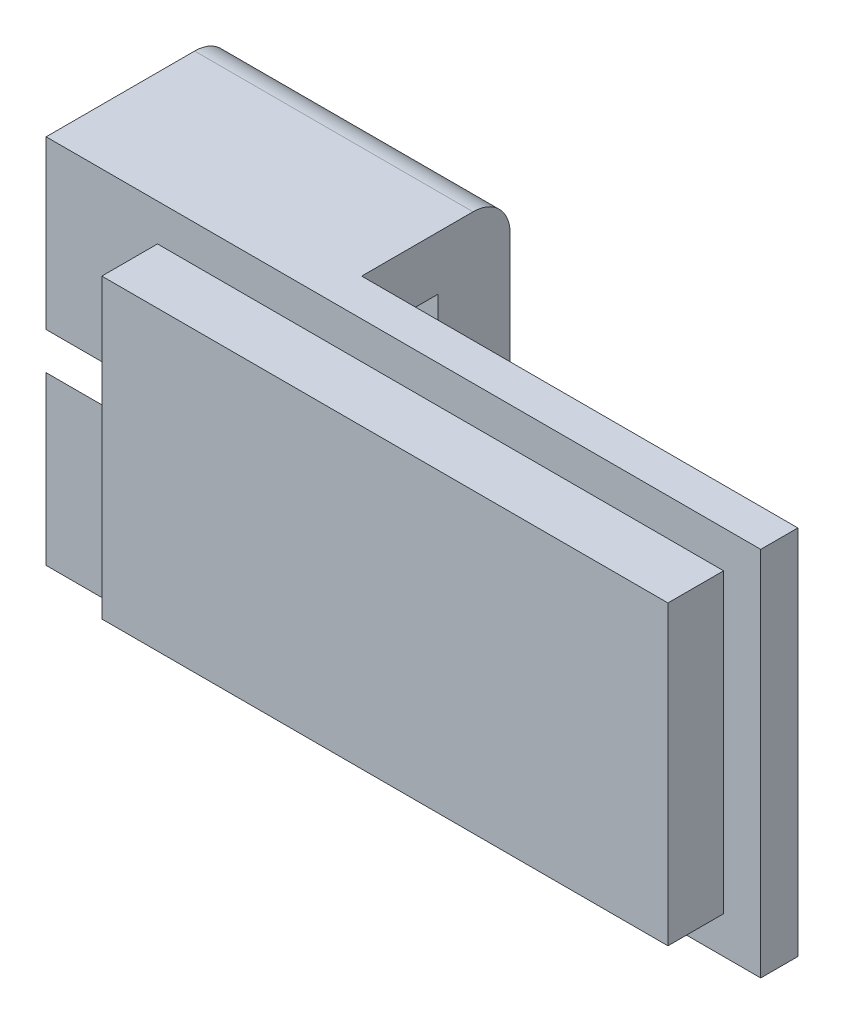
ISO-10303-21;
HEADER;
FILE_DESCRIPTION(('STEP AP214'),'2;1');
FILE_NAME('part.step','',(''),(''),'','','');
FILE_SCHEMA(('AUTOMOTIVE_DESIGN { 1 0 10303 214 1 1 1 1 }'));
ENDSEC;
DATA;
#1=APPLICATION_CONTEXT('core data for automotive mechanical design processes');
#2=APPLICATION_PROTOCOL_DEFINITION('international standard','automotive_design',2000,#1);
#3=PRODUCT_CONTEXT('',#1,'mechanical');
#4=PRODUCT('Part','Part','',(#3));
#5=PRODUCT_RELATED_PRODUCT_CATEGORY('part','',(#4));
#6=PRODUCT_DEFINITION_FORMATION('','',#4);
#7=PRODUCT_DEFINITION_CONTEXT('part definition',#1,'design');
#8=PRODUCT_DEFINITION('design','',#6,#7);
#9=PRODUCT_DEFINITION_SHAPE('','',#8);
#10=(LENGTH_UNIT() NAMED_UNIT(*) SI_UNIT(.MILLI.,.METRE.));
#11=(NAMED_UNIT(*) PLANE_ANGLE_UNIT() SI_UNIT($,.RADIAN.));
#12=(NAMED_UNIT(*) SI_UNIT($,.STERADIAN.) SOLID_ANGLE_UNIT());
#13=UNCERTAINTY_MEASURE_WITH_UNIT(LENGTH_MEASURE(1.E-05),#10,'distance_accuracy_value','');
#14=(GEOMETRIC_REPRESENTATION_CONTEXT(3) GLOBAL_UNCERTAINTY_ASSIGNED_CONTEXT((#13)) GLOBAL_UNIT_ASSIGNED_CONTEXT((#10,
#11,#12)) REPRESENTATION_CONTEXT('',''));
#15=CARTESIAN_POINT('',(0.,0.,0.));
#16=DIRECTION('',(0.,0.,1.));
#17=DIRECTION('',(1.,0.,0.));
#18=AXIS2_PLACEMENT_3D('',#15,#16,#17);
#19=CARTESIAN_POINT('',(38.5,0.,0.));
#20=DIRECTION('',(1.,0.,0.));
#21=DIRECTION('',(0.,0.,-1.));
#22=AXIS2_PLACEMENT_3D('',#19,#20,#21);
#23=PLANE('',#22);
#24=DIRECTION('',(0.,0.,-1.));
#25=VECTOR('',#24,1.);
#26=CARTESIAN_POINT('',(38.5,-10.,5.));
#27=LINE('',#26,#25);
#28=CARTESIAN_POINT('',(38.5,-10.,5.));
#29=VERTEX_POINT('',#28);
#30=CARTESIAN_POINT('',(38.5,-9.99999999999999,3.));
#31=VERTEX_POINT('',#30);
#32=EDGE_CURVE('E384',#29,#31,#27,.T.);
#33=ORIENTED_EDGE('',*,*,#32,.T.);
#34=DIRECTION('',(0.,-1.,0.));
#35=VECTOR('',#34,1.);
#36=CARTESIAN_POINT('',(38.5,-9.99999999999999,3.));
#37=LINE('',#36,#35);
#38=CARTESIAN_POINT('',(38.5,10.,3.));
#39=VERTEX_POINT('',#38);
#40=EDGE_CURVE('E306',#39,#31,#37,.T.);
#41=ORIENTED_EDGE('',*,*,#40,.F.);
#42=DIRECTION('',(0.,0.,1.));
#43=VECTOR('',#42,1.);
#44=CARTESIAN_POINT('',(38.5,10.,5.));
#45=LINE('',#44,#43);
#46=CARTESIAN_POINT('',(38.5,10.,5.));
#47=VERTEX_POINT('',#46);
#48=EDGE_CURVE('E377',#39,#47,#45,.T.);
#49=ORIENTED_EDGE('',*,*,#48,.T.);
#50=DIRECTION('',(0.,-1.,0.));
#51=VECTOR('',#50,1.);
#52=CARTESIAN_POINT('',(38.5,-10.,5.));
#53=LINE('',#52,#51);
#54=EDGE_CURVE('E380',#47,#29,#53,.T.);
#55=ORIENTED_EDGE('',*,*,#54,.T.);
#56=EDGE_LOOP('',(#33,#41,#49,#55));
#57=FACE_BOUND('',#56,.T.);
#58=ADVANCED_FACE('F45',(#57),#23,.T.);
#59=CARTESIAN_POINT('',(38.5,-10.,5.));
#60=DIRECTION('',(0.,0.,-1.));
#61=DIRECTION('',(-1.,0.,0.));
#62=AXIS2_PLACEMENT_3D('',#59,#60,#61);
#63=PLANE('',#62);
#64=DIRECTION('',(-1.,0.,0.));
#65=VECTOR('',#64,1.);
#66=CARTESIAN_POINT('',(9.99999999999998,-1.00498756211208,5.));
#67=LINE('',#66,#65);
#68=CARTESIAN_POINT('',(0.,-1.00498756211208,5.));
#69=VERTEX_POINT('',#68);
#70=CARTESIAN_POINT('',(6.,-1.00498756211208,5.));
#71=VERTEX_POINT('',#70);
#72=EDGE_CURVE('E337',#69,#71,#67,.F.);
#73=ORIENTED_EDGE('',*,*,#72,.F.);
#74=DIRECTION('',(0.,-1.,0.));
#75=VECTOR('',#74,1.);
#76=CARTESIAN_POINT('',(0.,-10.,5.));
#77=LINE('',#76,#75);
#78=CARTESIAN_POINT('',(0.,-10.,5.));
#79=VERTEX_POINT('',#78);
#80=EDGE_CURVE('E391',#69,#79,#77,.T.);
#81=ORIENTED_EDGE('',*,*,#80,.T.);
#82=DIRECTION('',(-1.,0.,0.));
#83=VECTOR('',#82,1.);
#84=CARTESIAN_POINT('',(38.5,-10.,5.));
#85=LINE('',#84,#83);
#86=EDGE_CURVE('E388',#29,#79,#85,.T.);
#87=ORIENTED_EDGE('',*,*,#86,.F.);
#88=ORIENTED_EDGE('',*,*,#54,.F.);
#89=DIRECTION('',(-1.,0.,0.));
#90=VECTOR('',#89,1.);
#91=CARTESIAN_POINT('',(38.5,10.,5.));
#92=LINE('',#91,#90);
#93=CARTESIAN_POINT('',(0.,10.,5.));
#94=VERTEX_POINT('',#93);
#95=EDGE_CURVE('E406',#47,#94,#92,.T.);
#96=ORIENTED_EDGE('',*,*,#95,.T.);
#97=CARTESIAN_POINT('',(0.,1.00498756211208,5.));
#98=VERTEX_POINT('',#97);
#99=EDGE_CURVE('E392',#94,#98,#77,.T.);
#100=ORIENTED_EDGE('',*,*,#99,.T.);
#101=DIRECTION('',(-1.,0.,0.));
#102=VECTOR('',#101,1.);
#103=CARTESIAN_POINT('',(9.99999999999998,1.00498756211208,5.));
#104=LINE('',#103,#102);
#105=CARTESIAN_POINT('',(6.,1.00498756211208,5.));
#106=VERTEX_POINT('',#105);
#107=EDGE_CURVE('E330',#106,#98,#104,.T.);
#108=ORIENTED_EDGE('',*,*,#107,.F.);
#109=DIRECTION('',(0.,-1.,0.));
#110=VECTOR('',#109,1.);
#111=CARTESIAN_POINT('',(6.,-10.,5.));
#112=LINE('',#111,#110);
#113=CARTESIAN_POINT('',(6.,8.,5.));
#114=VERTEX_POINT('',#113);
#115=EDGE_CURVE('E411',#114,#106,#112,.T.);
#116=ORIENTED_EDGE('',*,*,#115,.F.);
#117=DIRECTION('',(-1.,0.,0.));
#118=VECTOR('',#117,1.);
#119=CARTESIAN_POINT('',(38.5,8.00000000000001,5.));
#120=LINE('',#119,#118);
#121=CARTESIAN_POINT('',(36.5,8.00000000000001,5.));
#122=VERTEX_POINT('',#121);
#123=EDGE_CURVE('E415',#122,#114,#120,.T.);
#124=ORIENTED_EDGE('',*,*,#123,.F.);
#125=DIRECTION('',(0.,1.,0.));
#126=VECTOR('',#125,1.);
#127=CARTESIAN_POINT('',(36.5,-10.,5.));
#128=LINE('',#127,#126);
#129=CARTESIAN_POINT('',(36.5,-7.99999999999999,5.));
#130=VERTEX_POINT('',#129);
#131=EDGE_CURVE('E419',#130,#122,#128,.T.);
#132=ORIENTED_EDGE('',*,*,#131,.F.);
#133=DIRECTION('',(1.,0.,0.));
#134=VECTOR('',#133,1.);
#135=CARTESIAN_POINT('',(38.5,-7.99999999999999,5.));
#136=LINE('',#135,#134);
#137=CARTESIAN_POINT('',(6.,-8.,5.));
#138=VERTEX_POINT('',#137);
#139=EDGE_CURVE('E423',#138,#130,#136,.T.);
#140=ORIENTED_EDGE('',*,*,#139,.F.);
#141=EDGE_CURVE('E410',#71,#138,#112,.T.);
#142=ORIENTED_EDGE('',*,*,#141,.F.);
#143=EDGE_LOOP('',(#73,#81,#87,#88,#96,#100,#108,#116,#124,#132,#140,#142));
#144=FACE_BOUND('',#143,.T.);
#145=ADVANCED_FACE('F514',(#144),#63,.F.);
#146=CARTESIAN_POINT('',(38.5,-9.99999999999999,-5.));
#147=DIRECTION('',(0.,0.,1.));
#148=DIRECTION('',(1.,0.,0.));
#149=AXIS2_PLACEMENT_3D('',#146,#147,#148);
#150=PLANE('',#149);
#151=DIRECTION('',(-1.,0.,0.));
#152=VECTOR('',#151,1.);
#153=CARTESIAN_POINT('',(38.5,8.,-5.));
#154=LINE('',#153,#152);
#155=CARTESIAN_POINT('',(0.,8.,-5.));
#156=VERTEX_POINT('',#155);
#157=CARTESIAN_POINT('',(15.,8.,-5.));
#158=VERTEX_POINT('',#157);
#159=EDGE_CURVE('E434',#156,#158,#154,.F.);
#160=ORIENTED_EDGE('',*,*,#159,.T.);
#161=DIRECTION('',(0.,1.,0.));
#162=VECTOR('',#161,1.);
#163=CARTESIAN_POINT('',(15.,-9.99999999999999,-5.));
#164=LINE('',#163,#162);
#165=CARTESIAN_POINT('',(15.,-7.99999999999999,-5.));
#166=VERTEX_POINT('',#165);
#167=EDGE_CURVE('E251',#166,#158,#164,.T.);
#168=ORIENTED_EDGE('',*,*,#167,.F.);
#169=DIRECTION('',(-1.,0.,0.));
#170=VECTOR('',#169,1.);
#171=CARTESIAN_POINT('',(38.5,-7.99999999999999,-5.));
#172=LINE('',#171,#170);
#173=CARTESIAN_POINT('',(0.,-7.99999999999999,-5.));
#174=VERTEX_POINT('',#173);
#175=EDGE_CURVE('E438',#166,#174,#172,.T.);
#176=ORIENTED_EDGE('',*,*,#175,.T.);
#177=DIRECTION('',(0.,1.,0.));
#178=VECTOR('',#177,1.);
#179=CARTESIAN_POINT('',(0.,-9.99999999999999,-5.));
#180=LINE('',#179,#178);
#181=CARTESIAN_POINT('',(0.,-1.00498756211209,-5.));
#182=VERTEX_POINT('',#181);
#183=EDGE_CURVE('E381',#174,#182,#180,.T.);
#184=ORIENTED_EDGE('',*,*,#183,.T.);
#185=DIRECTION('',(-1.,0.,0.));
#186=VECTOR('',#185,1.);
#187=CARTESIAN_POINT('',(9.99999999999998,-1.00498756211209,-5.));
#188=LINE('',#187,#186);
#189=CARTESIAN_POINT('',(9.99999999999998,-1.00498756211209,-5.));
#190=VERTEX_POINT('',#189);
#191=EDGE_CURVE('E340',#190,#182,#188,.T.);
#192=ORIENTED_EDGE('',*,*,#191,.F.);
#193=DIRECTION('',(0.,1.,0.));
#194=VECTOR('',#193,1.);
#195=CARTESIAN_POINT('',(9.99999999999998,-9.99999999999999,-5.));
#196=LINE('',#195,#194);
#197=CARTESIAN_POINT('',(9.99999999999998,1.00498756211209,-5.));
#198=VERTEX_POINT('',#197);
#199=EDGE_CURVE('E430',#190,#198,#196,.T.);
#200=ORIENTED_EDGE('',*,*,#199,.T.);
#201=DIRECTION('',(-1.,0.,0.));
#202=VECTOR('',#201,1.);
#203=CARTESIAN_POINT('',(9.99999999999998,1.00498756211209,-5.));
#204=LINE('',#203,#202);
#205=CARTESIAN_POINT('',(0.,1.00498756211209,-5.));
#206=VERTEX_POINT('',#205);
#207=EDGE_CURVE('E344',#206,#198,#204,.F.);
#208=ORIENTED_EDGE('',*,*,#207,.F.);
#209=EDGE_CURVE('E400',#206,#156,#180,.T.);
#210=ORIENTED_EDGE('',*,*,#209,.T.);
#211=EDGE_LOOP('',(#160,#168,#176,#184,#192,#200,#208,#210));
#212=FACE_BOUND('',#211,.T.);
#213=ADVANCED_FACE('F463',(#212),#150,.F.);
#214=CARTESIAN_POINT('',(0.,0.,0.));
#215=DIRECTION('',(1.,0.,0.));
#216=DIRECTION('',(0.,0.,-1.));
#217=AXIS2_PLACEMENT_3D('',#214,#215,#216);
#218=PLANE('',#217);
#219=ORIENTED_EDGE('',*,*,#183,.F.);
#220=CARTESIAN_POINT('',(0.,-7.99999999999999,-3.));
#221=DIRECTION('',(1.,0.,0.));
#222=DIRECTION('',(0.,0.,-1.));
#223=AXIS2_PLACEMENT_3D('',#220,#221,#222);
#224=CIRCLE('',#223,2.);
#225=CARTESIAN_POINT('',(0.,-9.99999999999999,-3.));
#226=VERTEX_POINT('',#225);
#227=EDGE_CURVE('E441',#174,#226,#224,.F.);
#228=ORIENTED_EDGE('',*,*,#227,.T.);
#229=DIRECTION('',(0.,0.,-1.));
#230=VECTOR('',#229,1.);
#231=CARTESIAN_POINT('',(0.,-10.,5.));
#232=LINE('',#231,#230);
#233=EDGE_CURVE('E396',#79,#226,#232,.T.);
#234=ORIENTED_EDGE('',*,*,#233,.F.);
#235=ORIENTED_EDGE('',*,*,#80,.F.);
#236=CARTESIAN_POINT('',(0.,0.,0.));
#237=DIRECTION('',(1.,0.,0.));
#238=DIRECTION('',(0.,0.,-1.));
#239=AXIS2_PLACEMENT_3D('',#236,#237,#238);
#240=CIRCLE('',#239,5.1);
#241=EDGE_CURVE('E325',#69,#182,#240,.T.);
#242=ORIENTED_EDGE('',*,*,#241,.T.);
#243=EDGE_LOOP('',(#219,#228,#234,#235,#242));
#244=FACE_BOUND('',#243,.T.);
#245=ADVANCED_FACE('F501',(#244),#218,.F.);
#246=CARTESIAN_POINT('',(38.5,10.,5.));
#247=DIRECTION('',(0.,-1.,0.));
#248=DIRECTION('',(0.,0.,-1.));
#249=AXIS2_PLACEMENT_3D('',#246,#247,#248);
#250=PLANE('',#249);
#251=DIRECTION('',(1.,0.,0.));
#252=VECTOR('',#251,1.);
#253=CARTESIAN_POINT('',(15.,10.,3.));
#254=LINE('',#253,#252);
#255=CARTESIAN_POINT('',(15.,10.,3.));
#256=VERTEX_POINT('',#255);
#257=EDGE_CURVE('E303',#256,#39,#254,.T.);
#258=ORIENTED_EDGE('',*,*,#257,.F.);
#259=DIRECTION('',(0.,0.,-1.));
#260=VECTOR('',#259,1.);
#261=CARTESIAN_POINT('',(15.,10.,3.));
#262=LINE('',#261,#260);
#263=CARTESIAN_POINT('',(15.,10.,-3.));
#264=VERTEX_POINT('',#263);
#265=EDGE_CURVE('E313',#256,#264,#262,.T.);
#266=ORIENTED_EDGE('',*,*,#265,.T.);
#267=DIRECTION('',(-1.,0.,0.));
#268=VECTOR('',#267,1.);
#269=CARTESIAN_POINT('',(38.5,10.,-3.));
#270=LINE('',#269,#268);
#271=CARTESIAN_POINT('',(0.,10.,-3.));
#272=VERTEX_POINT('',#271);
#273=EDGE_CURVE('E448',#264,#272,#270,.T.);
#274=ORIENTED_EDGE('',*,*,#273,.T.);
#275=DIRECTION('',(0.,0.,1.));
#276=VECTOR('',#275,1.);
#277=CARTESIAN_POINT('',(0.,10.,5.));
#278=LINE('',#277,#276);
#279=EDGE_CURVE('E376',#272,#94,#278,.T.);
#280=ORIENTED_EDGE('',*,*,#279,.T.);
#281=ORIENTED_EDGE('',*,*,#95,.F.);
#282=ORIENTED_EDGE('',*,*,#48,.F.);
#283=EDGE_LOOP('',(#258,#266,#274,#280,#281,#282));
#284=FACE_BOUND('',#283,.T.);
#285=ADVANCED_FACE('F471',(#284),#250,.F.);
#286=CARTESIAN_POINT('',(38.5,-10.,5.));
#287=DIRECTION('',(0.,1.,0.));
#288=DIRECTION('',(0.,0.,1.));
#289=AXIS2_PLACEMENT_3D('',#286,#287,#288);
#290=PLANE('',#289);
#291=DIRECTION('',(-1.,0.,0.));
#292=VECTOR('',#291,1.);
#293=CARTESIAN_POINT('',(38.5,-9.99999999999999,-3.));
#294=LINE('',#293,#292);
#295=CARTESIAN_POINT('',(15.,-9.99999999999999,-3.));
#296=VERTEX_POINT('',#295);
#297=EDGE_CURVE('E444',#226,#296,#294,.F.);
#298=ORIENTED_EDGE('',*,*,#297,.T.);
#299=DIRECTION('',(0.,0.,-1.));
#300=VECTOR('',#299,1.);
#301=CARTESIAN_POINT('',(15.,-9.99999999999999,3.));
#302=LINE('',#301,#300);
#303=CARTESIAN_POINT('',(15.,-9.99999999999999,3.));
#304=VERTEX_POINT('',#303);
#305=EDGE_CURVE('E316',#304,#296,#302,.T.);
#306=ORIENTED_EDGE('',*,*,#305,.F.);
#307=DIRECTION('',(-1.,0.,0.));
#308=VECTOR('',#307,1.);
#309=CARTESIAN_POINT('',(15.,-9.99999999999999,3.));
#310=LINE('',#309,#308);
#311=EDGE_CURVE('E309',#31,#304,#310,.T.);
#312=ORIENTED_EDGE('',*,*,#311,.F.);
#313=ORIENTED_EDGE('',*,*,#32,.F.);
#314=ORIENTED_EDGE('',*,*,#86,.T.);
#315=ORIENTED_EDGE('',*,*,#233,.T.);
#316=EDGE_LOOP('',(#298,#306,#312,#313,#314,#315));
#317=FACE_BOUND('',#316,.T.);
#318=ADVANCED_FACE('F483',(#317),#290,.F.);
#319=ORIENTED_EDGE('',*,*,#279,.F.);
#320=CARTESIAN_POINT('',(0.,8.,-3.));
#321=DIRECTION('',(1.,0.,0.));
#322=DIRECTION('',(0.,0.,-1.));
#323=AXIS2_PLACEMENT_3D('',#320,#321,#322);
#324=CIRCLE('',#323,2.);
#325=EDGE_CURVE('E54',#272,#156,#324,.F.);
#326=ORIENTED_EDGE('',*,*,#325,.T.);
#327=ORIENTED_EDGE('',*,*,#209,.F.);
#328=EDGE_CURVE('E331',#206,#98,#240,.T.);
#329=ORIENTED_EDGE('',*,*,#328,.T.);
#330=ORIENTED_EDGE('',*,*,#99,.F.);
#331=EDGE_LOOP('',(#319,#326,#327,#329,#330));
#332=FACE_BOUND('',#331,.T.);
#333=ADVANCED_FACE('F456',(#332),#218,.F.);
#334=CARTESIAN_POINT('',(6.,-8.,7.99999999999998));
#335=DIRECTION('',(0.,1.,0.));
#336=DIRECTION('',(-1.,0.,0.));
#337=AXIS2_PLACEMENT_3D('',#334,#335,#336);
#338=PLANE('',#337);
#339=DIRECTION('',(0.,0.,-1.));
#340=VECTOR('',#339,1.);
#341=CARTESIAN_POINT('',(6.,-8.,7.99999999999998));
#342=LINE('',#341,#340);
#343=CARTESIAN_POINT('',(6.,-8.,7.99999999999998));
#344=VERTEX_POINT('',#343);
#345=EDGE_CURVE('E360',#344,#138,#342,.T.);
#346=ORIENTED_EDGE('',*,*,#345,.T.);
#347=ORIENTED_EDGE('',*,*,#139,.T.);
#348=DIRECTION('',(0.,0.,-1.));
#349=VECTOR('',#348,1.);
#350=CARTESIAN_POINT('',(36.5,-7.99999999999999,7.99999999999998));
#351=LINE('',#350,#349);
#352=CARTESIAN_POINT('',(36.5,-7.99999999999999,7.99999999999998));
#353=VERTEX_POINT('',#352);
#354=EDGE_CURVE('E372',#353,#130,#351,.T.);
#355=ORIENTED_EDGE('',*,*,#354,.F.);
#356=DIRECTION('',(1.,0.,0.));
#357=VECTOR('',#356,1.);
#358=CARTESIAN_POINT('',(6.,-8.,7.99999999999998));
#359=LINE('',#358,#357);
#360=EDGE_CURVE('E347',#344,#353,#359,.T.);
#361=ORIENTED_EDGE('',*,*,#360,.F.);
#362=EDGE_LOOP('',(#346,#347,#355,#361));
#363=FACE_BOUND('',#362,.T.);
#364=ADVANCED_FACE('F517',(#363),#338,.F.);
#365=CARTESIAN_POINT('',(36.5,-7.99999999999999,7.99999999999998));
#366=DIRECTION('',(-1.,0.,0.));
#367=DIRECTION('',(0.,0.,1.));
#368=AXIS2_PLACEMENT_3D('',#365,#366,#367);
#369=PLANE('',#368);
#370=ORIENTED_EDGE('',*,*,#354,.T.);
#371=ORIENTED_EDGE('',*,*,#131,.T.);
#372=DIRECTION('',(0.,0.,-1.));
#373=VECTOR('',#372,1.);
#374=CARTESIAN_POINT('',(36.5,8.00000000000001,7.99999999999998));
#375=LINE('',#374,#373);
#376=CARTESIAN_POINT('',(36.5,8.00000000000001,7.99999999999998));
#377=VERTEX_POINT('',#376);
#378=EDGE_CURVE('E368',#377,#122,#375,.T.);
#379=ORIENTED_EDGE('',*,*,#378,.F.);
#380=DIRECTION('',(0.,1.,0.));
#381=VECTOR('',#380,1.);
#382=CARTESIAN_POINT('',(36.5,-7.99999999999999,7.99999999999998));
#383=LINE('',#382,#381);
#384=EDGE_CURVE('E351',#353,#377,#383,.T.);
#385=ORIENTED_EDGE('',*,*,#384,.F.);
#386=EDGE_LOOP('',(#370,#371,#379,#385));
#387=FACE_BOUND('',#386,.T.);
#388=ADVANCED_FACE('F527',(#387),#369,.F.);
#389=CARTESIAN_POINT('',(6.,8.,7.99999999999998));
#390=DIRECTION('',(0.,-1.,0.));
#391=DIRECTION('',(1.,0.,0.));
#392=AXIS2_PLACEMENT_3D('',#389,#390,#391);
#393=PLANE('',#392);
#394=ORIENTED_EDGE('',*,*,#378,.T.);
#395=ORIENTED_EDGE('',*,*,#123,.T.);
#396=DIRECTION('',(0.,0.,-1.));
#397=VECTOR('',#396,1.);
#398=CARTESIAN_POINT('',(6.,8.,7.99999999999998));
#399=LINE('',#398,#397);
#400=CARTESIAN_POINT('',(6.,8.,7.99999999999998));
#401=VERTEX_POINT('',#400);
#402=EDGE_CURVE('E364',#401,#114,#399,.T.);
#403=ORIENTED_EDGE('',*,*,#402,.F.);
#404=DIRECTION('',(-1.,0.,0.));
#405=VECTOR('',#404,1.);
#406=CARTESIAN_POINT('',(6.,8.,7.99999999999998));
#407=LINE('',#406,#405);
#408=EDGE_CURVE('E354',#377,#401,#407,.T.);
#409=ORIENTED_EDGE('',*,*,#408,.F.);
#410=EDGE_LOOP('',(#394,#395,#403,#409));
#411=FACE_BOUND('',#410,.T.);
#412=ADVANCED_FACE('F524',(#411),#393,.F.);
#413=CARTESIAN_POINT('',(6.,-8.,7.99999999999998));
#414=DIRECTION('',(1.,0.,0.));
#415=DIRECTION('',(0.,0.,-1.));
#416=AXIS2_PLACEMENT_3D('',#413,#414,#415);
#417=PLANE('',#416);
#418=CARTESIAN_POINT('',(6.,0.,0.));
#419=DIRECTION('',(1.,0.,0.));
#420=DIRECTION('',(0.,0.,-1.));
#421=AXIS2_PLACEMENT_3D('',#418,#419,#420);
#422=CIRCLE('',#421,5.1);
#423=EDGE_CURVE('E427',#71,#106,#422,.F.);
#424=ORIENTED_EDGE('',*,*,#423,.F.);
#425=ORIENTED_EDGE('',*,*,#141,.T.);
#426=ORIENTED_EDGE('',*,*,#345,.F.);
#427=DIRECTION('',(0.,-1.,0.));
#428=VECTOR('',#427,1.);
#429=CARTESIAN_POINT('',(6.,-8.,7.99999999999998));
#430=LINE('',#429,#428);
#431=EDGE_CURVE('E357',#401,#344,#430,.T.);
#432=ORIENTED_EDGE('',*,*,#431,.F.);
#433=ORIENTED_EDGE('',*,*,#402,.T.);
#434=ORIENTED_EDGE('',*,*,#115,.T.);
#435=EDGE_LOOP('',(#424,#425,#426,#432,#433,#434));
#436=FACE_BOUND('',#435,.T.);
#437=ADVANCED_FACE('F510',(#436),#417,.F.);
#438=CARTESIAN_POINT('',(0.,0.,7.99999999999998));
#439=DIRECTION('',(0.,0.,1.));
#440=DIRECTION('',(1.,0.,0.));
#441=AXIS2_PLACEMENT_3D('',#438,#439,#440);
#442=PLANE('',#441);
#443=ORIENTED_EDGE('',*,*,#360,.T.);
#444=ORIENTED_EDGE('',*,*,#384,.T.);
#445=ORIENTED_EDGE('',*,*,#408,.T.);
#446=ORIENTED_EDGE('',*,*,#431,.T.);
#447=EDGE_LOOP('',(#443,#444,#445,#446));
#448=FACE_BOUND('',#447,.T.);
#449=ADVANCED_FACE('F519',(#448),#442,.T.);
#450=CARTESIAN_POINT('',(9.99999999999998,0.,0.));
#451=DIRECTION('',(1.,0.,0.));
#452=DIRECTION('',(0.,0.,-1.));
#453=AXIS2_PLACEMENT_3D('',#450,#451,#452);
#454=PLANE('',#453);
#455=CARTESIAN_POINT('',(9.99999999999998,0.,0.));
#456=DIRECTION('',(1.,0.,0.));
#457=DIRECTION('',(0.,0.,-1.));
#458=AXIS2_PLACEMENT_3D('',#455,#456,#457);
#459=CIRCLE('',#458,5.1);
#460=EDGE_CURVE('E326',#198,#190,#459,.T.);
#461=ORIENTED_EDGE('',*,*,#460,.F.);
#462=ORIENTED_EDGE('',*,*,#199,.F.);
#463=EDGE_LOOP('',(#461,#462));
#464=FACE_BOUND('',#463,.T.);
#465=ADVANCED_FACE('F555',(#464),#454,.F.);
#466=CARTESIAN_POINT('',(9.99999999999998,0.,0.));
#467=DIRECTION('',(-1.,0.,0.));
#468=DIRECTION('',(0.,0.,1.));
#469=AXIS2_PLACEMENT_3D('',#466,#467,#468);
#470=CYLINDRICAL_SURFACE('',#469,5.1);
#471=ORIENTED_EDGE('',*,*,#207,.T.);
#472=ORIENTED_EDGE('',*,*,#460,.T.);
#473=ORIENTED_EDGE('',*,*,#191,.T.);
#474=ORIENTED_EDGE('',*,*,#241,.F.);
#475=ORIENTED_EDGE('',*,*,#72,.T.);
#476=ORIENTED_EDGE('',*,*,#423,.T.);
#477=ORIENTED_EDGE('',*,*,#107,.T.);
#478=ORIENTED_EDGE('',*,*,#328,.F.);
#479=EDGE_LOOP('',(#471,#472,#473,#474,#475,#476,#477,#478));
#480=FACE_BOUND('',#479,.T.);
#481=ADVANCED_FACE('F497',(#480),#470,.F.);
#482=CARTESIAN_POINT('',(38.5,-7.99999999999999,-3.));
#483=DIRECTION('',(-1.,0.,0.));
#484=DIRECTION('',(0.,0.,1.));
#485=AXIS2_PLACEMENT_3D('',#482,#483,#484);
#486=CYLINDRICAL_SURFACE('',#485,2.);
#487=CARTESIAN_POINT('',(15.,-7.99999999999999,-3.));
#488=DIRECTION('',(-1.,0.,0.));
#489=DIRECTION('',(0.,-1.,0.));
#490=AXIS2_PLACEMENT_3D('',#487,#488,#489);
#491=CIRCLE('',#490,2.);
#492=EDGE_CURVE('E319',#296,#166,#491,.F.);
#493=ORIENTED_EDGE('',*,*,#492,.F.);
#494=ORIENTED_EDGE('',*,*,#297,.F.);
#495=ORIENTED_EDGE('',*,*,#227,.F.);
#496=ORIENTED_EDGE('',*,*,#175,.F.);
#497=EDGE_LOOP('',(#493,#494,#495,#496));
#498=FACE_BOUND('',#497,.T.);
#499=ADVANCED_FACE('F490',(#498),#486,.T.);
#500=CARTESIAN_POINT('',(38.5,8.,-3.));
#501=DIRECTION('',(-1.,0.,0.));
#502=DIRECTION('',(0.,0.,1.));
#503=AXIS2_PLACEMENT_3D('',#500,#501,#502);
#504=CYLINDRICAL_SURFACE('',#503,2.);
#505=CARTESIAN_POINT('',(15.,8.,-3.));
#506=DIRECTION('',(-1.,0.,0.));
#507=DIRECTION('',(0.,-1.,0.));
#508=AXIS2_PLACEMENT_3D('',#505,#506,#507);
#509=CIRCLE('',#508,2.);
#510=EDGE_CURVE('E11',#158,#264,#509,.F.);
#511=ORIENTED_EDGE('',*,*,#510,.F.);
#512=ORIENTED_EDGE('',*,*,#159,.F.);
#513=ORIENTED_EDGE('',*,*,#325,.F.);
#514=ORIENTED_EDGE('',*,*,#273,.F.);
#515=EDGE_LOOP('',(#511,#512,#513,#514));
#516=FACE_BOUND('',#515,.T.);
#517=ADVANCED_FACE('F47',(#516),#504,.T.);
#518=CARTESIAN_POINT('',(15.,-9.99999999999999,3.));
#519=DIRECTION('',(-1.,0.,0.));
#520=DIRECTION('',(0.,-1.,0.));
#521=AXIS2_PLACEMENT_3D('',#518,#519,#520);
#522=PLANE('',#521);
#523=DIRECTION('',(0.,-1.,0.));
#524=VECTOR('',#523,1.);
#525=CARTESIAN_POINT('',(15.,4.9,1.1));
#526=LINE('',#525,#524);
#527=CARTESIAN_POINT('',(15.,7.1,1.1));
#528=VERTEX_POINT('',#527);
#529=CARTESIAN_POINT('',(15.,4.9,1.1));
#530=VERTEX_POINT('',#529);
#531=EDGE_CURVE('E242',#528,#530,#526,.T.);
#532=ORIENTED_EDGE('',*,*,#531,.F.);
#533=DIRECTION('',(0.,0.,1.));
#534=VECTOR('',#533,1.);
#535=CARTESIAN_POINT('',(15.,7.1,1.1));
#536=LINE('',#535,#534);
#537=CARTESIAN_POINT('',(15.,7.1,-1.1));
#538=VERTEX_POINT('',#537);
#539=EDGE_CURVE('E61',#538,#528,#536,.T.);
#540=ORIENTED_EDGE('',*,*,#539,.F.);
#541=DIRECTION('',(0.,1.,0.));
#542=VECTOR('',#541,1.);
#543=CARTESIAN_POINT('',(15.,4.9,-1.1));
#544=LINE('',#543,#542);
#545=CARTESIAN_POINT('',(15.,4.9,-1.1));
#546=VERTEX_POINT('',#545);
#547=EDGE_CURVE('E229',#546,#538,#544,.T.);
#548=ORIENTED_EDGE('',*,*,#547,.F.);
#549=DIRECTION('',(0.,0.,-1.));
#550=VECTOR('',#549,1.);
#551=CARTESIAN_POINT('',(15.,4.9,1.1));
#552=LINE('',#551,#550);
#553=EDGE_CURVE('E233',#530,#546,#552,.T.);
#554=ORIENTED_EDGE('',*,*,#553,.F.);
#555=EDGE_LOOP('',(#532,#540,#548,#554));
#556=FACE_BOUND('',#555,.T.);
#557=DIRECTION('',(0.,-1.,0.));
#558=VECTOR('',#557,1.);
#559=CARTESIAN_POINT('',(15.,-4.9,1.1));
#560=LINE('',#559,#558);
#561=CARTESIAN_POINT('',(15.,-4.9,1.1));
#562=VERTEX_POINT('',#561);
#563=CARTESIAN_POINT('',(15.,-7.1,1.1));
#564=VERTEX_POINT('',#563);
#565=EDGE_CURVE('E279',#562,#564,#560,.T.);
#566=ORIENTED_EDGE('',*,*,#565,.F.);
#567=DIRECTION('',(0.,0.,1.));
#568=VECTOR('',#567,1.);
#569=CARTESIAN_POINT('',(15.,-4.9,1.1));
#570=LINE('',#569,#568);
#571=CARTESIAN_POINT('',(15.,-4.9,-1.1));
#572=VERTEX_POINT('',#571);
#573=EDGE_CURVE('E69',#572,#562,#570,.T.);
#574=ORIENTED_EDGE('',*,*,#573,.F.);
#575=DIRECTION('',(0.,1.,0.));
#576=VECTOR('',#575,1.);
#577=CARTESIAN_POINT('',(15.,-4.9,-1.1));
#578=LINE('',#577,#576);
#579=CARTESIAN_POINT('',(15.,-7.1,-1.1));
#580=VERTEX_POINT('',#579);
#581=EDGE_CURVE('E270',#580,#572,#578,.T.);
#582=ORIENTED_EDGE('',*,*,#581,.F.);
#583=DIRECTION('',(0.,0.,-1.));
#584=VECTOR('',#583,1.);
#585=CARTESIAN_POINT('',(15.,-7.1,1.1));
#586=LINE('',#585,#584);
#587=EDGE_CURVE('E274',#564,#580,#586,.T.);
#588=ORIENTED_EDGE('',*,*,#587,.F.);
#589=EDGE_LOOP('',(#566,#574,#582,#588));
#590=FACE_BOUND('',#589,.T.);
#591=ORIENTED_EDGE('',*,*,#492,.T.);
#592=ORIENTED_EDGE('',*,*,#167,.T.);
#593=ORIENTED_EDGE('',*,*,#510,.T.);
#594=ORIENTED_EDGE('',*,*,#265,.F.);
#595=DIRECTION('',(0.,1.,0.));
#596=VECTOR('',#595,1.);
#597=CARTESIAN_POINT('',(15.,-9.99999999999999,3.));
#598=LINE('',#597,#596);
#599=EDGE_CURVE('E299',#304,#256,#598,.T.);
#600=ORIENTED_EDGE('',*,*,#599,.F.);
#601=ORIENTED_EDGE('',*,*,#305,.T.);
#602=EDGE_LOOP('',(#591,#592,#593,#594,#600,#601));
#603=FACE_BOUND('',#602,.T.);
#604=ADVANCED_FACE('F468',(#556,#590,#603),#522,.F.);
#605=CARTESIAN_POINT('',(0.,0.,3.));
#606=DIRECTION('',(0.,0.,-1.));
#607=DIRECTION('',(-1.,0.,0.));
#608=AXIS2_PLACEMENT_3D('',#605,#606,#607);
#609=PLANE('',#608);
#610=ORIENTED_EDGE('',*,*,#599,.T.);
#611=ORIENTED_EDGE('',*,*,#257,.T.);
#612=ORIENTED_EDGE('',*,*,#40,.T.);
#613=ORIENTED_EDGE('',*,*,#311,.T.);
#614=EDGE_LOOP('',(#610,#611,#612,#613));
#615=FACE_BOUND('',#614,.T.);
#616=ADVANCED_FACE('F476',(#615),#609,.T.);
#617=CARTESIAN_POINT('',(12.,-4.9,1.1));
#618=DIRECTION('',(0.,1.,0.));
#619=DIRECTION('',(-1.,0.,0.));
#620=AXIS2_PLACEMENT_3D('',#617,#618,#619);
#621=PLANE('',#620);
#622=ORIENTED_EDGE('',*,*,#573,.T.);
#623=DIRECTION('',(1.,0.,0.));
#624=VECTOR('',#623,1.);
#625=CARTESIAN_POINT('',(12.,-4.9,1.1));
#626=LINE('',#625,#624);
#627=CARTESIAN_POINT('',(12.,-4.9,1.1));
#628=VERTEX_POINT('',#627);
#629=EDGE_CURVE('E257',#628,#562,#626,.T.);
#630=ORIENTED_EDGE('',*,*,#629,.F.);
#631=DIRECTION('',(0.,0.,1.));
#632=VECTOR('',#631,1.);
#633=CARTESIAN_POINT('',(12.,-4.9,1.1));
#634=LINE('',#633,#632);
#635=CARTESIAN_POINT('',(12.,-4.9,-1.1));
#636=VERTEX_POINT('',#635);
#637=EDGE_CURVE('E275',#636,#628,#634,.T.);
#638=ORIENTED_EDGE('',*,*,#637,.F.);
#639=DIRECTION('',(1.,0.,0.));
#640=VECTOR('',#639,1.);
#641=CARTESIAN_POINT('',(12.,-4.9,-1.1));
#642=LINE('',#641,#640);
#643=EDGE_CURVE('E267',#636,#572,#642,.T.);
#644=ORIENTED_EDGE('',*,*,#643,.T.);
#645=EDGE_LOOP('',(#622,#630,#638,#644));
#646=FACE_BOUND('',#645,.T.);
#647=ADVANCED_FACE('F620',(#646),#621,.F.);
#648=CARTESIAN_POINT('',(12.,-4.9,-1.1));
#649=DIRECTION('',(0.,0.,-1.));
#650=DIRECTION('',(-1.,0.,0.));
#651=AXIS2_PLACEMENT_3D('',#648,#649,#650);
#652=PLANE('',#651);
#653=ORIENTED_EDGE('',*,*,#581,.T.);
#654=ORIENTED_EDGE('',*,*,#643,.F.);
#655=DIRECTION('',(0.,1.,0.));
#656=VECTOR('',#655,1.);
#657=CARTESIAN_POINT('',(12.,-4.9,-1.1));
#658=LINE('',#657,#656);
#659=CARTESIAN_POINT('',(12.,-7.1,-1.1));
#660=VERTEX_POINT('',#659);
#661=EDGE_CURVE('E260',#660,#636,#658,.T.);
#662=ORIENTED_EDGE('',*,*,#661,.F.);
#663=DIRECTION('',(1.,0.,0.));
#664=VECTOR('',#663,1.);
#665=CARTESIAN_POINT('',(12.,-7.1,-1.1));
#666=LINE('',#665,#664);
#667=EDGE_CURVE('E264',#660,#580,#666,.T.);
#668=ORIENTED_EDGE('',*,*,#667,.T.);
#669=EDGE_LOOP('',(#653,#654,#662,#668));
#670=FACE_BOUND('',#669,.T.);
#671=ADVANCED_FACE('F628',(#670),#652,.F.);
#672=CARTESIAN_POINT('',(12.,-7.1,1.1));
#673=DIRECTION('',(0.,-1.,0.));
#674=DIRECTION('',(1.,0.,0.));
#675=AXIS2_PLACEMENT_3D('',#672,#673,#674);
#676=PLANE('',#675);
#677=ORIENTED_EDGE('',*,*,#587,.T.);
#678=ORIENTED_EDGE('',*,*,#667,.F.);
#679=DIRECTION('',(0.,0.,-1.));
#680=VECTOR('',#679,1.);
#681=CARTESIAN_POINT('',(12.,-7.1,1.1));
#682=LINE('',#681,#680);
#683=CARTESIAN_POINT('',(12.,-7.1,1.1));
#684=VERTEX_POINT('',#683);
#685=EDGE_CURVE('E288',#684,#660,#682,.T.);
#686=ORIENTED_EDGE('',*,*,#685,.F.);
#687=DIRECTION('',(1.,0.,0.));
#688=VECTOR('',#687,1.);
#689=CARTESIAN_POINT('',(12.,-7.1,1.1));
#690=LINE('',#689,#688);
#691=EDGE_CURVE('E261',#684,#564,#690,.T.);
#692=ORIENTED_EDGE('',*,*,#691,.T.);
#693=EDGE_LOOP('',(#677,#678,#686,#692));
#694=FACE_BOUND('',#693,.T.);
#695=ADVANCED_FACE('F637',(#694),#676,.F.);
#696=CARTESIAN_POINT('',(12.,-4.9,1.1));
#697=DIRECTION('',(0.,0.,1.));
#698=DIRECTION('',(1.,0.,0.));
#699=AXIS2_PLACEMENT_3D('',#696,#697,#698);
#700=PLANE('',#699);
#701=ORIENTED_EDGE('',*,*,#565,.T.);
#702=ORIENTED_EDGE('',*,*,#691,.F.);
#703=DIRECTION('',(0.,-1.,0.));
#704=VECTOR('',#703,1.);
#705=CARTESIAN_POINT('',(12.,-4.9,1.1));
#706=LINE('',#705,#704);
#707=EDGE_CURVE('E292',#628,#684,#706,.T.);
#708=ORIENTED_EDGE('',*,*,#707,.F.);
#709=ORIENTED_EDGE('',*,*,#629,.T.);
#710=EDGE_LOOP('',(#701,#702,#708,#709));
#711=FACE_BOUND('',#710,.T.);
#712=ADVANCED_FACE('F647',(#711),#700,.F.);
#713=CARTESIAN_POINT('',(12.,0.,0.));
#714=DIRECTION('',(-1.,0.,0.));
#715=DIRECTION('',(0.,0.,1.));
#716=AXIS2_PLACEMENT_3D('',#713,#714,#715);
#717=PLANE('',#716);
#718=ORIENTED_EDGE('',*,*,#637,.T.);
#719=ORIENTED_EDGE('',*,*,#707,.T.);
#720=ORIENTED_EDGE('',*,*,#685,.T.);
#721=ORIENTED_EDGE('',*,*,#661,.T.);
#722=EDGE_LOOP('',(#718,#719,#720,#721));
#723=FACE_BOUND('',#722,.T.);
#724=ADVANCED_FACE('F657',(#723),#717,.F.);
#725=CARTESIAN_POINT('',(12.,7.1,1.1));
#726=DIRECTION('',(0.,1.,0.));
#727=DIRECTION('',(-1.,0.,0.));
#728=AXIS2_PLACEMENT_3D('',#725,#726,#727);
#729=PLANE('',#728);
#730=ORIENTED_EDGE('',*,*,#539,.T.);
#731=DIRECTION('',(1.,0.,0.));
#732=VECTOR('',#731,1.);
#733=CARTESIAN_POINT('',(12.,7.1,1.1));
#734=LINE('',#733,#732);
#735=CARTESIAN_POINT('',(12.,7.1,1.1));
#736=VERTEX_POINT('',#735);
#737=EDGE_CURVE('E204',#736,#528,#734,.T.);
#738=ORIENTED_EDGE('',*,*,#737,.F.);
#739=DIRECTION('',(0.,0.,1.));
#740=VECTOR('',#739,1.);
#741=CARTESIAN_POINT('',(12.,7.1,1.1));
#742=LINE('',#741,#740);
#743=CARTESIAN_POINT('',(12.,7.1,-1.1));
#744=VERTEX_POINT('',#743);
#745=EDGE_CURVE('E208',#744,#736,#742,.T.);
#746=ORIENTED_EDGE('',*,*,#745,.F.);
#747=DIRECTION('',(1.,0.,0.));
#748=VECTOR('',#747,1.);
#749=CARTESIAN_POINT('',(12.,7.1,-1.1));
#750=LINE('',#749,#748);
#751=EDGE_CURVE('E248',#744,#538,#750,.T.);
#752=ORIENTED_EDGE('',*,*,#751,.T.);
#753=EDGE_LOOP('',(#730,#738,#746,#752));
#754=FACE_BOUND('',#753,.T.);
#755=ADVANCED_FACE('F206',(#754),#729,.F.);
#756=CARTESIAN_POINT('',(12.,4.9,-1.1));
#757=DIRECTION('',(0.,0.,-1.));
#758=DIRECTION('',(-1.,0.,0.));
#759=AXIS2_PLACEMENT_3D('',#756,#757,#758);
#760=PLANE('',#759);
#761=ORIENTED_EDGE('',*,*,#547,.T.);
#762=ORIENTED_EDGE('',*,*,#751,.F.);
#763=DIRECTION('',(0.,1.,0.));
#764=VECTOR('',#763,1.);
#765=CARTESIAN_POINT('',(12.,4.9,-1.1));
#766=LINE('',#765,#764);
#767=CARTESIAN_POINT('',(12.,4.9,-1.1));
#768=VERTEX_POINT('',#767);
#769=EDGE_CURVE('E215',#768,#744,#766,.T.);
#770=ORIENTED_EDGE('',*,*,#769,.F.);
#771=DIRECTION('',(1.,0.,0.));
#772=VECTOR('',#771,1.);
#773=CARTESIAN_POINT('',(12.,4.9,-1.1));
#774=LINE('',#773,#772);
#775=EDGE_CURVE('E252',#768,#546,#774,.T.);
#776=ORIENTED_EDGE('',*,*,#775,.T.);
#777=EDGE_LOOP('',(#761,#762,#770,#776));
#778=FACE_BOUND('',#777,.T.);
#779=ADVANCED_FACE('F676',(#778),#760,.F.);
#780=CARTESIAN_POINT('',(12.,4.9,1.1));
#781=DIRECTION('',(0.,-1.,0.));
#782=DIRECTION('',(1.,0.,0.));
#783=AXIS2_PLACEMENT_3D('',#780,#781,#782);
#784=PLANE('',#783);
#785=ORIENTED_EDGE('',*,*,#553,.T.);
#786=ORIENTED_EDGE('',*,*,#775,.F.);
#787=DIRECTION('',(0.,0.,-1.));
#788=VECTOR('',#787,1.);
#789=CARTESIAN_POINT('',(12.,4.9,1.1));
#790=LINE('',#789,#788);
#791=CARTESIAN_POINT('',(12.,4.9,1.1));
#792=VERTEX_POINT('',#791);
#793=EDGE_CURVE('E224',#792,#768,#790,.T.);
#794=ORIENTED_EDGE('',*,*,#793,.F.);
#795=DIRECTION('',(1.,0.,0.));
#796=VECTOR('',#795,1.);
#797=CARTESIAN_POINT('',(12.,4.9,1.1));
#798=LINE('',#797,#796);
#799=EDGE_CURVE('E214',#792,#530,#798,.T.);
#800=ORIENTED_EDGE('',*,*,#799,.T.);
#801=EDGE_LOOP('',(#785,#786,#794,#800));
#802=FACE_BOUND('',#801,.T.);
#803=ADVANCED_FACE('F685',(#802),#784,.F.);
#804=CARTESIAN_POINT('',(12.,4.9,1.1));
#805=DIRECTION('',(0.,0.,1.));
#806=DIRECTION('',(1.,0.,0.));
#807=AXIS2_PLACEMENT_3D('',#804,#805,#806);
#808=PLANE('',#807);
#809=ORIENTED_EDGE('',*,*,#531,.T.);
#810=ORIENTED_EDGE('',*,*,#799,.F.);
#811=DIRECTION('',(0.,-1.,0.));
#812=VECTOR('',#811,1.);
#813=CARTESIAN_POINT('',(12.,4.9,1.1));
#814=LINE('',#813,#812);
#815=EDGE_CURVE('E218',#736,#792,#814,.T.);
#816=ORIENTED_EDGE('',*,*,#815,.F.);
#817=ORIENTED_EDGE('',*,*,#737,.T.);
#818=EDGE_LOOP('',(#809,#810,#816,#817));
#819=FACE_BOUND('',#818,.T.);
#820=ADVANCED_FACE('F219',(#819),#808,.F.);
#821=CARTESIAN_POINT('',(12.,0.,0.));
#822=DIRECTION('',(1.,0.,0.));
#823=DIRECTION('',(0.,0.,-1.));
#824=AXIS2_PLACEMENT_3D('',#821,#822,#823);
#825=PLANE('',#824);
#826=ORIENTED_EDGE('',*,*,#745,.T.);
#827=ORIENTED_EDGE('',*,*,#815,.T.);
#828=ORIENTED_EDGE('',*,*,#793,.T.);
#829=ORIENTED_EDGE('',*,*,#769,.T.);
#830=EDGE_LOOP('',(#826,#827,#828,#829));
#831=FACE_BOUND('',#830,.T.);
#832=ADVANCED_FACE('F226',(#831),#825,.T.);
#833=CLOSED_SHELL('',(#58,#145,#213,#245,#285,#318,#333,#364,#388,#412,#437,#449,#465,#481,#499,
#517,#604,#616,#647,#671,#695,#712,#724,#755,#779,#803,#820,#832));
#834=MANIFOLD_SOLID_BREP('B2',#833);
#835=ADVANCED_BREP_SHAPE_REPRESENTATION('',(#18,#834),#14);
#836=SHAPE_DEFINITION_REPRESENTATION(#9,#835);
ENDSEC;
END-ISO-10303-21;
